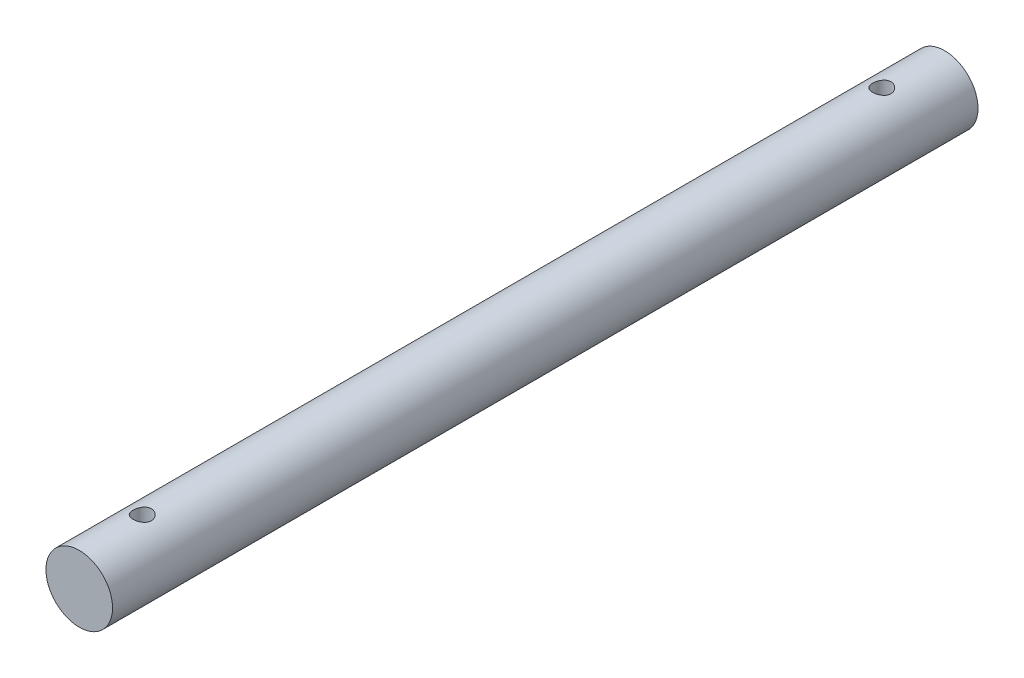
ISO-10303-21;
HEADER;
FILE_DESCRIPTION(('STEP AP214'),'2;1');
FILE_NAME('part.step','',(''),(''),'','','');
FILE_SCHEMA(('AUTOMOTIVE_DESIGN { 1 0 10303 214 1 1 1 1 }'));
ENDSEC;
DATA;
#1=APPLICATION_CONTEXT('core data for automotive mechanical design processes');
#2=APPLICATION_PROTOCOL_DEFINITION('international standard','automotive_design',2000,#1);
#3=PRODUCT_CONTEXT('',#1,'mechanical');
#4=PRODUCT('Part','Part','',(#3));
#5=PRODUCT_RELATED_PRODUCT_CATEGORY('part','',(#4));
#6=PRODUCT_DEFINITION_FORMATION('','',#4);
#7=PRODUCT_DEFINITION_CONTEXT('part definition',#1,'design');
#8=PRODUCT_DEFINITION('design','',#6,#7);
#9=PRODUCT_DEFINITION_SHAPE('','',#8);
#10=(LENGTH_UNIT() NAMED_UNIT(*) SI_UNIT(.MILLI.,.METRE.));
#11=(NAMED_UNIT(*) PLANE_ANGLE_UNIT() SI_UNIT($,.RADIAN.));
#12=(NAMED_UNIT(*) SI_UNIT($,.STERADIAN.) SOLID_ANGLE_UNIT());
#13=UNCERTAINTY_MEASURE_WITH_UNIT(LENGTH_MEASURE(1.E-05),#10,'distance_accuracy_value','');
#14=(GEOMETRIC_REPRESENTATION_CONTEXT(3) GLOBAL_UNCERTAINTY_ASSIGNED_CONTEXT((#13)) GLOBAL_UNIT_ASSIGNED_CONTEXT((#10,
#11,#12)) REPRESENTATION_CONTEXT('',''));
#15=CARTESIAN_POINT('',(0.,0.,0.));
#16=DIRECTION('',(0.,0.,1.));
#17=DIRECTION('',(1.,0.,0.));
#18=AXIS2_PLACEMENT_3D('',#15,#16,#17);
#19=CARTESIAN_POINT('',(0.,0.,165.));
#20=DIRECTION('',(0.,0.,-1.));
#21=DIRECTION('',(-1.,0.,0.));
#22=AXIS2_PLACEMENT_3D('',#19,#20,#21);
#23=CYLINDRICAL_SURFACE('',#22,6.35);
#24=CARTESIAN_POINT('',(0.,-6.35,13.75));
#25=CARTESIAN_POINT('',(0.0963519088727711,-6.34999867632888,13.7499979722522));
#26=CARTESIAN_POINT('',(0.192725104479355,-6.34778557573284,13.7420159379501));
#27=CARTESIAN_POINT('',(0.382687404049166,-6.33917231251588,13.7103601208736));
#28=CARTESIAN_POINT('',(0.476275282158253,-6.33277033399392,13.6866795326332));
#29=CARTESIAN_POINT('',(0.657898060834848,-6.31648461747214,13.6244608815283));
#30=CARTESIAN_POINT('',(0.745940208566188,-6.30660553951491,13.5859426976602));
#31=CARTESIAN_POINT('',(0.914315444706306,-6.2844051890964,13.4952179872864));
#32=CARTESIAN_POINT('',(0.994647881541182,-6.27208371048882,13.4430103052238));
#33=CARTESIAN_POINT('',(1.14730128913682,-6.24598550703679,13.3250319990548));
#34=CARTESIAN_POINT('',(1.21940542146178,-6.23218259591821,13.2589865976986));
#35=CARTESIAN_POINT('',(1.3516672162458,-6.20484218880023,13.1157945484562));
#36=CARTESIAN_POINT('',(1.41182322728868,-6.19130472972315,13.0386463685312));
#37=CARTESIAN_POINT('',(1.51955971162734,-6.16575784450081,12.8736813267357));
#38=CARTESIAN_POINT('',(1.56688684325104,-6.15378133466715,12.7856934423482));
#39=CARTESIAN_POINT('',(1.64598886021075,-6.13309905563514,12.60262558299));
#40=CARTESIAN_POINT('',(1.67776683148114,-6.12439263752407,12.5075470195774));
#41=CARTESIAN_POINT('',(1.72410795404839,-6.11150732964254,12.3154072515994));
#42=CARTESIAN_POINT('',(1.73906600605339,-6.10722478121721,12.2184484161789));
#43=CARTESIAN_POINT('',(1.75257440461544,-6.10336272474979,12.0233102324382));
#44=CARTESIAN_POINT('',(1.7511280444799,-6.10378227272676,11.9251311330483));
#45=CARTESIAN_POINT('',(1.73218132150678,-6.1091844592592,11.733453890354));
#46=CARTESIAN_POINT('',(1.71516301402608,-6.1140300738052,11.6399036148967));
#47=CARTESIAN_POINT('',(1.66632929326106,-6.12751843096004,11.4570405860802));
#48=CARTESIAN_POINT('',(1.63451262583765,-6.13616149539368,11.3677281925823));
#49=CARTESIAN_POINT('',(1.55660241655713,-6.1563884762099,11.1946396936547));
#50=CARTESIAN_POINT('',(1.51034317029268,-6.16800622854485,11.1109422962485));
#51=CARTESIAN_POINT('',(1.40497640039737,-6.19285586921667,10.9523306185894));
#52=CARTESIAN_POINT('',(1.34586619363417,-6.2060880943833,10.8774181775699));
#53=CARTESIAN_POINT('',(1.21402875473287,-6.23324237421661,10.7357536441173));
#54=CARTESIAN_POINT('',(1.1408978916237,-6.24717237722987,10.669378147492));
#55=CARTESIAN_POINT('',(0.984371586439517,-6.27373931665034,10.5497533468747));
#56=CARTESIAN_POINT('',(0.900975683702518,-6.28637619497963,10.4965046322927));
#57=CARTESIAN_POINT('',(0.725677538022721,-6.30901976468089,10.404463341389));
#58=CARTESIAN_POINT('',(0.63373563103454,-6.31901326998532,10.3657428500394));
#59=CARTESIAN_POINT('',(0.444308077394627,-6.33514896111822,10.3044190510004));
#60=CARTESIAN_POINT('',(0.346823733220866,-6.34129204775181,10.2818119734093));
#61=CARTESIAN_POINT('',(0.152289233464204,-6.34889689335871,10.2539571535065));
#62=CARTESIAN_POINT('',(0.0553176087366918,-6.35049656566665,10.248197837111));
#63=CARTESIAN_POINT('',(-0.138207338003046,-6.34923293119334,10.252783830092));
#64=CARTESIAN_POINT('',(-0.23476070523862,-6.34637011963161,10.2631273524725));
#65=CARTESIAN_POINT('',(-0.422855479295822,-6.33659261452674,10.299207155861));
#66=CARTESIAN_POINT('',(-0.514456610077173,-6.32975399979316,10.3246546026308));
#67=CARTESIAN_POINT('',(-0.692078206811861,-6.31280403798355,10.3898813911304));
#68=CARTESIAN_POINT('',(-0.778098046797714,-6.30269232457343,10.4296623371607));
#69=CARTESIAN_POINT('',(-0.944076143072927,-6.27999893142339,10.523352291319));
#70=CARTESIAN_POINT('',(-1.02387339106312,-6.26737073917275,10.5775349829825));
#71=CARTESIAN_POINT('',(-1.17342140193015,-6.24110221310927,10.6981493975883));
#72=CARTESIAN_POINT('',(-1.24317003549124,-6.22746166570202,10.7645837098863));
#73=CARTESIAN_POINT('',(-1.37282234323046,-6.20019250778253,10.910208303409));
#74=CARTESIAN_POINT('',(-1.43236411423498,-6.1865767563179,10.9897238280738));
#75=CARTESIAN_POINT('',(-1.53727145833525,-6.1613487605109,11.1579088848369));
#76=CARTESIAN_POINT('',(-1.58263758500952,-6.14973643793979,11.2465780592925));
#77=CARTESIAN_POINT('',(-1.6575672902585,-6.12996519939161,11.4301408981596));
#78=CARTESIAN_POINT('',(-1.68721946856189,-6.12178697646601,11.5249962025192));
#79=CARTESIAN_POINT('',(-1.73007082482112,-6.10981664265364,11.7186129896961));
#80=CARTESIAN_POINT('',(-1.74327456097828,-6.10602331664286,11.8173733825025));
#81=CARTESIAN_POINT('',(-1.75257918487232,-6.10335860076689,12.0122783793584));
#82=CARTESIAN_POINT('',(-1.74926373166691,-6.10431923481735,12.108393226173));
#83=CARTESIAN_POINT('',(-1.72698809535782,-6.11065818123702,12.2986365456577));
#84=CARTESIAN_POINT('',(-1.70802836817025,-6.11603636486697,12.3927650761325));
#85=CARTESIAN_POINT('',(-1.65535117195365,-6.13050103505147,12.5755730459156));
#86=CARTESIAN_POINT('',(-1.62176531415431,-6.13955440279027,12.6642932169514));
#87=CARTESIAN_POINT('',(-1.54089107612842,-6.16034822130196,12.8349080898204));
#88=CARTESIAN_POINT('',(-1.49360041587854,-6.17208911912213,12.9168016530116));
#89=CARTESIAN_POINT('',(-1.38492373267777,-6.19739353518559,13.074204971082));
#90=CARTESIAN_POINT('',(-1.3231432438508,-6.21100256102313,13.1494350841929));
#91=CARTESIAN_POINT('',(-1.1879804426183,-6.23826480003665,13.2886497856069));
#92=CARTESIAN_POINT('',(-1.11459526948214,-6.25191802329291,13.3526315927976));
#93=CARTESIAN_POINT('',(-0.956242084730487,-6.27811133290747,13.46900582464));
#94=CARTESIAN_POINT('',(-0.871043881385525,-6.29061803846423,13.5210932108011));
#95=CARTESIAN_POINT('',(-0.6927566990203,-6.31273579212554,13.6101250437831));
#96=CARTESIAN_POINT('',(-0.599672481844751,-6.32234857193568,13.6470785514049));
#97=CARTESIAN_POINT('',(-0.422537342823388,-6.3364541555639,13.7003541015963));
#98=CARTESIAN_POINT('',(-0.339200192467298,-6.34149559617014,13.7189263039));
#99=CARTESIAN_POINT('',(-0.17058077386909,-6.34826891571434,13.7437494485749));
#100=CARTESIAN_POINT('',(-0.0852987284220124,-6.35000117182384,13.7500017951311));
#101=CARTESIAN_POINT('',(0.,-6.35,13.75));
#102=B_SPLINE_CURVE_WITH_KNOTS('',3,(#24,#25,#26,#27,#28,#29,#30,#31,#32,#33,#34,#35,#36,#37,
#38,#39,#40,#41,#42,#43,#44,#45,#46,#47,#48,#49,#50,#51,#52,#53,#54,#55,#56,#57,#58,#59,#60,#61,
#62,#63,#64,#65,#66,#67,#68,#69,#70,#71,#72,#73,#74,#75,#76,#77,#78,#79,#80,#81,#82,#83,#84,#85,
#86,#87,#88,#89,#90,#91,#92,#93,#94,#95,#96,#97,#98,#99,#100,#101),.UNSPECIFIED.,.T.,.F.,(4,2,2,
2,2,2,2,2,2,2,2,2,2,2,2,2,2,2,2,2,2,2,2,2,2,2,2,2,2,2,2,2,2,2,2,2,2,2,4),(0.,0.288742785383583,
0.577610825317706,0.866093186465203,1.15459990680863,1.44949634186622,1.74443350787695,
2.0448291201908,2.34516509085837,2.63829205755673,2.93136017788392,3.21565198677317,
3.49996789336338,3.78767378736865,4.07543980883368,4.37326080152658,4.67109516434464,
4.97038834669267,5.26961148326536,5.55964941687571,5.84965516611863,6.13428610036824,
6.41894890230507,6.70946497589746,7.0000425199995,7.29941558754897,7.59877696270436,
7.89643199466905,8.19400452194523,8.48113931351604,8.76826573750457,9.05286021964921,
9.33750207605805,9.63104328546516,9.92465697036179,10.225117310347,10.525397497878,
10.7810457813303,11.0366649249715),.UNSPECIFIED.);
#103=CARTESIAN_POINT('',(0.,-6.35,13.75));
#104=VERTEX_POINT('',#103);
#105=EDGE_CURVE('E10',#104,#104,#102,.T.);
#106=ORIENTED_EDGE('',*,*,#105,.T.);
#107=EDGE_LOOP('',(#106));
#108=FACE_BOUND('',#107,.T.);
#109=CARTESIAN_POINT('',(0.,6.35,13.75));
#110=CARTESIAN_POINT('',(-0.0963519088727681,6.34999867632888,13.7499979722522));
#111=CARTESIAN_POINT('',(-0.192725104479352,6.34778557573284,13.7420159379501));
#112=CARTESIAN_POINT('',(-0.382687404049163,6.33917231251588,13.7103601208736));
#113=CARTESIAN_POINT('',(-0.47627528215825,6.33277033399392,13.6866795326332));
#114=CARTESIAN_POINT('',(-0.657898060834845,6.31648461747214,13.6244608815283));
#115=CARTESIAN_POINT('',(-0.745940208566185,6.3066055395149,13.5859426976602));
#116=CARTESIAN_POINT('',(-0.914315444706302,6.2844051890964,13.4952179872864));
#117=CARTESIAN_POINT('',(-0.994647881541178,6.27208371048881,13.4430103052238));
#118=CARTESIAN_POINT('',(-1.14730128913682,6.24598550703679,13.3250319990548));
#119=CARTESIAN_POINT('',(-1.21940542146178,6.23218259591821,13.2589865976986));
#120=CARTESIAN_POINT('',(-1.3516672162458,6.20484218880023,13.1157945484562));
#121=CARTESIAN_POINT('',(-1.41182322728867,6.19130472972316,13.0386463685312));
#122=CARTESIAN_POINT('',(-1.51955971162734,6.16575784450082,12.8736813267357));
#123=CARTESIAN_POINT('',(-1.56688684325104,6.15378133466715,12.7856934423482));
#124=CARTESIAN_POINT('',(-1.64598886021074,6.13309905563514,12.60262558299));
#125=CARTESIAN_POINT('',(-1.67776683148113,6.12439263752407,12.5075470195774));
#126=CARTESIAN_POINT('',(-1.72410795404839,6.11150732964254,12.3154072515994));
#127=CARTESIAN_POINT('',(-1.73906600605339,6.10722478121721,12.2184484161789));
#128=CARTESIAN_POINT('',(-1.75257440461543,6.10336272474979,12.0233102324382));
#129=CARTESIAN_POINT('',(-1.7511280444799,6.10378227272676,11.9251311330483));
#130=CARTESIAN_POINT('',(-1.73218132150678,6.1091844592592,11.733453890354));
#131=CARTESIAN_POINT('',(-1.71516301402608,6.1140300738052,11.6399036148967));
#132=CARTESIAN_POINT('',(-1.66632929326106,6.12751843096004,11.4570405860802));
#133=CARTESIAN_POINT('',(-1.63451262583765,6.13616149539368,11.3677281925823));
#134=CARTESIAN_POINT('',(-1.55660241655712,6.1563884762099,11.1946396936547));
#135=CARTESIAN_POINT('',(-1.51034317029268,6.16800622854485,11.1109422962485));
#136=CARTESIAN_POINT('',(-1.40497640039737,6.19285586921667,10.9523306185894));
#137=CARTESIAN_POINT('',(-1.34586619363416,6.2060880943833,10.8774181775699));
#138=CARTESIAN_POINT('',(-1.21402875473286,6.23324237421661,10.7357536441173));
#139=CARTESIAN_POINT('',(-1.14089789162369,6.24717237722987,10.669378147492));
#140=CARTESIAN_POINT('',(-0.984371586439513,6.27373931665034,10.5497533468747));
#141=CARTESIAN_POINT('',(-0.900975683702515,6.28637619497963,10.4965046322927));
#142=CARTESIAN_POINT('',(-0.725677538022718,6.30901976468089,10.404463341389));
#143=CARTESIAN_POINT('',(-0.633735631034537,6.31901326998532,10.3657428500394));
#144=CARTESIAN_POINT('',(-0.444308077394624,6.33514896111822,10.3044190510004));
#145=CARTESIAN_POINT('',(-0.346823733220863,6.34129204775181,10.2818119734093));
#146=CARTESIAN_POINT('',(-0.1522892334642,6.34889689335871,10.2539571535065));
#147=CARTESIAN_POINT('',(-0.0553176087366886,6.35049656566665,10.248197837111));
#148=CARTESIAN_POINT('',(0.138207338003049,6.34923293119334,10.252783830092));
#149=CARTESIAN_POINT('',(0.234760705238623,6.34637011963161,10.2631273524725));
#150=CARTESIAN_POINT('',(0.422855479295825,6.33659261452674,10.299207155861));
#151=CARTESIAN_POINT('',(0.514456610077176,6.32975399979316,10.3246546026308));
#152=CARTESIAN_POINT('',(0.692078206811864,6.31280403798355,10.3898813911304));
#153=CARTESIAN_POINT('',(0.778098046797718,6.30269232457343,10.4296623371607));
#154=CARTESIAN_POINT('',(0.94407614307293,6.27999893142339,10.523352291319));
#155=CARTESIAN_POINT('',(1.02387339106313,6.26737073917275,10.5775349829825));
#156=CARTESIAN_POINT('',(1.17342140193016,6.24110221310927,10.6981493975883));
#157=CARTESIAN_POINT('',(1.24317003549125,6.22746166570202,10.7645837098863));
#158=CARTESIAN_POINT('',(1.37282234323046,6.20019250778253,10.910208303409));
#159=CARTESIAN_POINT('',(1.43236411423498,6.1865767563179,10.9897238280738));
#160=CARTESIAN_POINT('',(1.53727145833525,6.16134876051089,11.1579088848369));
#161=CARTESIAN_POINT('',(1.58263758500952,6.14973643793978,11.2465780592925));
#162=CARTESIAN_POINT('',(1.6575672902585,6.12996519939161,11.4301408981596));
#163=CARTESIAN_POINT('',(1.68721946856189,6.121786976466,11.5249962025192));
#164=CARTESIAN_POINT('',(1.73007082482112,6.10981664265364,11.7186129896961));
#165=CARTESIAN_POINT('',(1.74327456097828,6.10602331664285,11.8173733825025));
#166=CARTESIAN_POINT('',(1.75257918487232,6.10335860076689,12.0122783793584));
#167=CARTESIAN_POINT('',(1.74926373166691,6.10431923481735,12.108393226173));
#168=CARTESIAN_POINT('',(1.72698809535783,6.11065818123702,12.2986365456577));
#169=CARTESIAN_POINT('',(1.70802836817025,6.11603636486696,12.3927650761325));
#170=CARTESIAN_POINT('',(1.65535117195365,6.13050103505146,12.5755730459156));
#171=CARTESIAN_POINT('',(1.62176531415431,6.13955440279026,12.6642932169514));
#172=CARTESIAN_POINT('',(1.54089107612843,6.16034822130196,12.8349080898204));
#173=CARTESIAN_POINT('',(1.49360041587855,6.17208911912212,12.9168016530116));
#174=CARTESIAN_POINT('',(1.38492373267778,6.19739353518559,13.074204971082));
#175=CARTESIAN_POINT('',(1.32314324385081,6.21100256102313,13.1494350841929));
#176=CARTESIAN_POINT('',(1.1879804426183,6.23826480003665,13.2886497856069));
#177=CARTESIAN_POINT('',(1.11459526948214,6.25191802329291,13.3526315927976));
#178=CARTESIAN_POINT('',(0.956242084730492,6.27811133290746,13.46900582464));
#179=CARTESIAN_POINT('',(0.87104388138553,6.29061803846423,13.5210932108011));
#180=CARTESIAN_POINT('',(0.692756699020306,6.31273579212554,13.6101250437831));
#181=CARTESIAN_POINT('',(0.599672481844755,6.32234857193568,13.6470785514049));
#182=CARTESIAN_POINT('',(0.422537342823392,6.3364541555639,13.7003541015963));
#183=CARTESIAN_POINT('',(0.339200192467303,6.34149559617013,13.7189263039));
#184=CARTESIAN_POINT('',(0.170580773869094,6.34826891571434,13.7437494485749));
#185=CARTESIAN_POINT('',(0.0852987284220158,6.35000117182384,13.7500017951311));
#186=CARTESIAN_POINT('',(0.,6.35,13.75));
#187=B_SPLINE_CURVE_WITH_KNOTS('',3,(#109,#110,#111,#112,#113,#114,#115,#116,#117,#118,#119,
#120,#121,#122,#123,#124,#125,#126,#127,#128,#129,#130,#131,#132,#133,#134,#135,#136,#137,#138,
#139,#140,#141,#142,#143,#144,#145,#146,#147,#148,#149,#150,#151,#152,#153,#154,#155,#156,#157,
#158,#159,#160,#161,#162,#163,#164,#165,#166,#167,#168,#169,#170,#171,#172,#173,#174,#175,#176,
#177,#178,#179,#180,#181,#182,#183,#184,#185,#186),.UNSPECIFIED.,.T.,.F.,(4,2,2,2,2,2,2,2,2,2,2,
2,2,2,2,2,2,2,2,2,2,2,2,2,2,2,2,2,2,2,2,2,2,2,2,2,2,2,4),(0.,0.288742785383583,
0.577610825317706,0.866093186465203,1.15459990680863,1.44949634186622,1.74443350787695,
2.04482912019081,2.34516509085837,2.63829205755673,2.93136017788392,3.21565198677317,
3.49996789336338,3.78767378736865,4.07543980883368,4.37326080152658,4.67109516434464,
4.97038834669267,5.26961148326536,5.55964941687571,5.84965516611863,6.13428610036824,
6.41894890230507,6.70946497589746,7.00004251999949,7.29941558754897,7.59877696270436,
7.89643199466905,8.19400452194523,8.48113931351604,8.76826573750457,9.0528602196492,
9.33750207605804,9.63104328546516,9.92465697036178,10.225117310347,10.525397497878,
10.7810457813303,11.0366649249715),.UNSPECIFIED.);
#188=CARTESIAN_POINT('',(0.,6.35,13.75));
#189=VERTEX_POINT('',#188);
#190=EDGE_CURVE('E44',#189,#189,#187,.T.);
#191=ORIENTED_EDGE('',*,*,#190,.T.);
#192=EDGE_LOOP('',(#191));
#193=FACE_BOUND('',#192,.T.);
#194=CARTESIAN_POINT('',(0.,-6.35,154.75));
#195=CARTESIAN_POINT('',(0.0963519088727893,-6.34999867632888,154.749997972252));
#196=CARTESIAN_POINT('',(0.192725104479373,-6.34778557573284,154.74201593795));
#197=CARTESIAN_POINT('',(0.382687404049185,-6.33917231251588,154.710360120874));
#198=CARTESIAN_POINT('',(0.476275282158271,-6.33277033399392,154.686679532633));
#199=CARTESIAN_POINT('',(0.65789806083487,-6.31648461747213,154.624460881528));
#200=CARTESIAN_POINT('',(0.745940208566214,-6.3066055395149,154.58594269766));
#201=CARTESIAN_POINT('',(0.914315444706334,-6.2844051890964,154.495217987286));
#202=CARTESIAN_POINT('',(0.994647881541208,-6.27208371048881,154.443010305224));
#203=CARTESIAN_POINT('',(1.14730128913685,-6.24598550703679,154.325031999055));
#204=CARTESIAN_POINT('',(1.21940542146182,-6.23218259591821,154.258986597699));
#205=CARTESIAN_POINT('',(1.35166721624583,-6.20484218880022,154.115794548456));
#206=CARTESIAN_POINT('',(1.4118232272887,-6.19130472972315,154.038646368531));
#207=CARTESIAN_POINT('',(1.51955971162735,-6.16575784450081,153.873681326736));
#208=CARTESIAN_POINT('',(1.56688684325104,-6.15378133466715,153.785693442348));
#209=CARTESIAN_POINT('',(1.64598886021075,-6.13309905563514,153.60262558299));
#210=CARTESIAN_POINT('',(1.67776683148114,-6.12439263752406,153.507547019577));
#211=CARTESIAN_POINT('',(1.72410795404841,-6.11150732964254,153.315407251599));
#212=CARTESIAN_POINT('',(1.73906600605341,-6.10722478121721,153.218448416179));
#213=CARTESIAN_POINT('',(1.75257440461546,-6.10336272474978,153.023310232438));
#214=CARTESIAN_POINT('',(1.75112804447992,-6.10378227272676,152.925131133048));
#215=CARTESIAN_POINT('',(1.73218132150679,-6.10918445925919,152.733453890354));
#216=CARTESIAN_POINT('',(1.7151630140261,-6.1140300738052,152.639903614897));
#217=CARTESIAN_POINT('',(1.66632929326108,-6.12751843096003,152.45704058608));
#218=CARTESIAN_POINT('',(1.63451262583767,-6.13616149539367,152.367728192582));
#219=CARTESIAN_POINT('',(1.55660241655715,-6.1563884762099,152.194639693655));
#220=CARTESIAN_POINT('',(1.51034317029271,-6.16800622854484,152.110942296249));
#221=CARTESIAN_POINT('',(1.4049764003974,-6.19285586921666,151.952330618589));
#222=CARTESIAN_POINT('',(1.34586619363419,-6.2060880943833,151.87741817757));
#223=CARTESIAN_POINT('',(1.21402875473287,-6.23324237421661,151.735753644117));
#224=CARTESIAN_POINT('',(1.1408978916237,-6.24717237722987,151.669378147492));
#225=CARTESIAN_POINT('',(0.984371586439519,-6.27373931665034,151.549753346875));
#226=CARTESIAN_POINT('',(0.900975683702526,-6.28637619497962,151.496504632293));
#227=CARTESIAN_POINT('',(0.72567753802273,-6.30901976468088,151.404463341389));
#228=CARTESIAN_POINT('',(0.633735631034546,-6.31901326998532,151.365742850039));
#229=CARTESIAN_POINT('',(0.444308077394631,-6.33514896111822,151.304419051));
#230=CARTESIAN_POINT('',(0.346823733220872,-6.34129204775181,151.281811973409));
#231=CARTESIAN_POINT('',(0.152289233464212,-6.34889689335871,151.253957153507));
#232=CARTESIAN_POINT('',(0.0553176087367009,-6.35049656566665,151.248197837111));
#233=CARTESIAN_POINT('',(-0.138207338003038,-6.34923293119334,151.252783830092));
#234=CARTESIAN_POINT('',(-0.234760705238613,-6.34637011963161,151.263127352473));
#235=CARTESIAN_POINT('',(-0.422855479295813,-6.33659261452674,151.299207155861));
#236=CARTESIAN_POINT('',(-0.514456610077161,-6.32975399979316,151.324654602631));
#237=CARTESIAN_POINT('',(-0.692078206811848,-6.31280403798355,151.38988139113));
#238=CARTESIAN_POINT('',(-0.778098046797705,-6.30269232457343,151.429662337161));
#239=CARTESIAN_POINT('',(-0.944076143072919,-6.27999893142339,151.523352291319));
#240=CARTESIAN_POINT('',(-1.02387339106311,-6.26737073917276,151.577534982983));
#241=CARTESIAN_POINT('',(-1.17342140193014,-6.24110221310927,151.698149397588));
#242=CARTESIAN_POINT('',(-1.24317003549122,-6.22746166570202,151.764583709886));
#243=CARTESIAN_POINT('',(-1.37282234323044,-6.20019250778254,151.910208303409));
#244=CARTESIAN_POINT('',(-1.43236411423496,-6.1865767563179,151.989723828074));
#245=CARTESIAN_POINT('',(-1.53727145833523,-6.1613487605109,152.157908884837));
#246=CARTESIAN_POINT('',(-1.58263758500951,-6.14973643793979,152.246578059293));
#247=CARTESIAN_POINT('',(-1.65756729025848,-6.12996519939162,152.43014089816));
#248=CARTESIAN_POINT('',(-1.68721946856187,-6.12178697646601,152.524996202519));
#249=CARTESIAN_POINT('',(-1.7300708248211,-6.10981664265364,152.718612989696));
#250=CARTESIAN_POINT('',(-1.74327456097826,-6.10602331664286,152.817373382502));
#251=CARTESIAN_POINT('',(-1.7525791848723,-6.10335860076689,153.012278379358));
#252=CARTESIAN_POINT('',(-1.74926373166689,-6.10431923481736,153.108393226173));
#253=CARTESIAN_POINT('',(-1.72698809535781,-6.11065818123702,153.298636545658));
#254=CARTESIAN_POINT('',(-1.70802836817023,-6.11603636486697,153.392765076133));
#255=CARTESIAN_POINT('',(-1.65535117195363,-6.13050103505147,153.575573045916));
#256=CARTESIAN_POINT('',(-1.62176531415429,-6.13955440279027,153.664293216951));
#257=CARTESIAN_POINT('',(-1.54089107612841,-6.16034822130197,153.83490808982));
#258=CARTESIAN_POINT('',(-1.49360041587853,-6.17208911912213,153.916801653012));
#259=CARTESIAN_POINT('',(-1.38492373267776,-6.19739353518559,154.074204971082));
#260=CARTESIAN_POINT('',(-1.32314324385079,-6.21100256102313,154.149435084193));
#261=CARTESIAN_POINT('',(-1.18798044261829,-6.23826480003665,154.288649785607));
#262=CARTESIAN_POINT('',(-1.11459526948213,-6.25191802329291,154.352631592798));
#263=CARTESIAN_POINT('',(-0.95624208473048,-6.27811133290747,154.46900582464));
#264=CARTESIAN_POINT('',(-0.871043881385514,-6.29061803846423,154.521093210801));
#265=CARTESIAN_POINT('',(-0.692756699020283,-6.31273579212554,154.610125043783));
#266=CARTESIAN_POINT('',(-0.59967248184473,-6.32234857193569,154.647078551405));
#267=CARTESIAN_POINT('',(-0.422537342823363,-6.3364541555639,154.700354101596));
#268=CARTESIAN_POINT('',(-0.339200192467274,-6.34149559617014,154.7189263039));
#269=CARTESIAN_POINT('',(-0.170580773869068,-6.34826891571434,154.743749448575));
#270=CARTESIAN_POINT('',(-0.0852987284219928,-6.35000117182384,154.750001795131));
#271=CARTESIAN_POINT('',(0.,-6.35,154.75));
#272=B_SPLINE_CURVE_WITH_KNOTS('',3,(#194,#195,#196,#197,#198,#199,#200,#201,#202,#203,#204,
#205,#206,#207,#208,#209,#210,#211,#212,#213,#214,#215,#216,#217,#218,#219,#220,#221,#222,#223,
#224,#225,#226,#227,#228,#229,#230,#231,#232,#233,#234,#235,#236,#237,#238,#239,#240,#241,#242,
#243,#244,#245,#246,#247,#248,#249,#250,#251,#252,#253,#254,#255,#256,#257,#258,#259,#260,#261,
#262,#263,#264,#265,#266,#267,#268,#269,#270,#271),.UNSPECIFIED.,.T.,.F.,(4,2,2,2,2,2,2,2,2,2,2,
2,2,2,2,2,2,2,2,2,2,2,2,2,2,2,2,2,2,2,2,2,2,2,2,2,2,2,4),(0.,0.288742785383586,
0.577610825317708,0.866093186465209,1.15459990680864,1.44949634186625,1.74443350787696,
2.04482912019075,2.34516509085834,2.63829205755673,2.93136017788394,3.21565198677317,
3.49996789336339,3.78767378736862,4.07543980883371,4.37326080152659,4.67109516434465,
4.97038834669268,5.26961148326536,5.55964941687572,5.84965516611864,6.13428610036825,
6.41894890230507,6.70946497589747,7.00004251999949,7.29941558754897,7.59877696270435,
7.89643199466904,8.19400452194525,8.48113931351605,8.76826573750455,9.05286021964918,
9.33750207605805,9.63104328546515,9.92465697036178,10.225117310347,10.5253974978781,
10.7810457813303,11.0366649249715),.UNSPECIFIED.);
#273=CARTESIAN_POINT('',(0.,-6.35,154.75));
#274=VERTEX_POINT('',#273);
#275=EDGE_CURVE('E48',#274,#274,#272,.T.);
#276=ORIENTED_EDGE('',*,*,#275,.T.);
#277=EDGE_LOOP('',(#276));
#278=FACE_BOUND('',#277,.T.);
#279=CARTESIAN_POINT('',(0.,6.35,154.75));
#280=CARTESIAN_POINT('',(-0.0963519088727516,6.34999867632888,154.749997972252));
#281=CARTESIAN_POINT('',(-0.192725104479336,6.34778557573284,154.74201593795));
#282=CARTESIAN_POINT('',(-0.382687404049147,6.33917231251588,154.710360120874));
#283=CARTESIAN_POINT('',(-0.476275282158233,6.33277033399392,154.686679532633));
#284=CARTESIAN_POINT('',(-0.657898060834832,6.31648461747214,154.624460881528));
#285=CARTESIAN_POINT('',(-0.745940208566176,6.30660553951491,154.58594269766));
#286=CARTESIAN_POINT('',(-0.914315444706297,6.2844051890964,154.495217987286));
#287=CARTESIAN_POINT('',(-0.994647881541171,6.27208371048882,154.443010305224));
#288=CARTESIAN_POINT('',(-1.14730128913682,6.24598550703679,154.325031999055));
#289=CARTESIAN_POINT('',(-1.21940542146178,6.23218259591821,154.258986597699));
#290=CARTESIAN_POINT('',(-1.35166721624579,6.20484218880023,154.115794548456));
#291=CARTESIAN_POINT('',(-1.41182322728866,6.19130472972316,154.038646368531));
#292=CARTESIAN_POINT('',(-1.51955971162732,6.16575784450082,153.873681326736));
#293=CARTESIAN_POINT('',(-1.566886843251,6.15378133466716,153.785693442348));
#294=CARTESIAN_POINT('',(-1.64598886021071,6.13309905563515,153.60262558299));
#295=CARTESIAN_POINT('',(-1.67776683148111,6.12439263752408,153.507547019577));
#296=CARTESIAN_POINT('',(-1.72410795404837,6.11150732964255,153.315407251599));
#297=CARTESIAN_POINT('',(-1.73906600605337,6.10722478121722,153.218448416179));
#298=CARTESIAN_POINT('',(-1.75257440461542,6.1033627247498,153.023310232438));
#299=CARTESIAN_POINT('',(-1.75112804447989,6.10378227272677,152.925131133048));
#300=CARTESIAN_POINT('',(-1.73218132150676,6.1091844592592,152.733453890354));
#301=CARTESIAN_POINT('',(-1.71516301402606,6.11403007380521,152.639903614897));
#302=CARTESIAN_POINT('',(-1.66632929326105,6.12751843096004,152.45704058608));
#303=CARTESIAN_POINT('',(-1.63451262583764,6.13616149539368,152.367728192582));
#304=CARTESIAN_POINT('',(-1.5566024165571,6.15638847620991,152.194639693655));
#305=CARTESIAN_POINT('',(-1.51034317029265,6.16800622854486,152.110942296249));
#306=CARTESIAN_POINT('',(-1.40497640039734,6.19285586921667,151.952330618589));
#307=CARTESIAN_POINT('',(-1.34586619363414,6.2060880943833,151.87741817757));
#308=CARTESIAN_POINT('',(-1.21402875473284,6.23324237421662,151.735753644117));
#309=CARTESIAN_POINT('',(-1.14089789162366,6.24717237722988,151.669378147492));
#310=CARTESIAN_POINT('',(-0.984371586439481,6.27373931665034,151.549753346875));
#311=CARTESIAN_POINT('',(-0.900975683702488,6.28637619497963,151.496504632293));
#312=CARTESIAN_POINT('',(-0.725677538022693,6.30901976468089,151.404463341389));
#313=CARTESIAN_POINT('',(-0.633735631034509,6.31901326998532,151.365742850039));
#314=CARTESIAN_POINT('',(-0.444308077394595,6.33514896111822,151.304419051));
#315=CARTESIAN_POINT('',(-0.346823733220836,6.34129204775181,151.281811973409));
#316=CARTESIAN_POINT('',(-0.152289233464176,6.34889689335871,151.253957153507));
#317=CARTESIAN_POINT('',(-0.0553176087366653,6.35049656566665,151.248197837111));
#318=CARTESIAN_POINT('',(0.138207338003073,6.34923293119334,151.252783830092));
#319=CARTESIAN_POINT('',(0.234760705238648,6.34637011963161,151.263127352473));
#320=CARTESIAN_POINT('',(0.422855479295848,6.33659261452674,151.299207155861));
#321=CARTESIAN_POINT('',(0.514456610077196,6.32975399979316,151.324654602631));
#322=CARTESIAN_POINT('',(0.692078206811884,6.31280403798355,151.38988139113));
#323=CARTESIAN_POINT('',(0.778098046797741,6.30269232457343,151.429662337161));
#324=CARTESIAN_POINT('',(0.944076143072955,6.27999893142338,151.523352291319));
#325=CARTESIAN_POINT('',(1.02387339106315,6.26737073917275,151.577534982983));
#326=CARTESIAN_POINT('',(1.17342140193018,6.24110221310927,151.698149397588));
#327=CARTESIAN_POINT('',(1.24317003549126,6.22746166570201,151.764583709886));
#328=CARTESIAN_POINT('',(1.37282234323047,6.20019250778253,151.910208303409));
#329=CARTESIAN_POINT('',(1.432364114235,6.1865767563179,151.989723828074));
#330=CARTESIAN_POINT('',(1.53727145833526,6.16134876051089,152.157908884837));
#331=CARTESIAN_POINT('',(1.58263758500954,6.14973643793978,152.246578059293));
#332=CARTESIAN_POINT('',(1.65756729025852,6.12996519939161,152.43014089816));
#333=CARTESIAN_POINT('',(1.6872194685619,6.121786976466,152.524996202519));
#334=CARTESIAN_POINT('',(1.73007082482114,6.10981664265363,152.718612989696));
#335=CARTESIAN_POINT('',(1.7432745609783,6.10602331664285,152.817373382502));
#336=CARTESIAN_POINT('',(1.75257918487234,6.10335860076688,153.012278379358));
#337=CARTESIAN_POINT('',(1.74926373166693,6.10431923481734,153.108393226173));
#338=CARTESIAN_POINT('',(1.72698809535784,6.11065818123701,153.298636545658));
#339=CARTESIAN_POINT('',(1.70802836817027,6.11603636486696,153.392765076133));
#340=CARTESIAN_POINT('',(1.65535117195367,6.13050103505146,153.575573045916));
#341=CARTESIAN_POINT('',(1.62176531415433,6.13955440279026,153.664293216951));
#342=CARTESIAN_POINT('',(1.54089107612845,6.16034822130196,153.83490808982));
#343=CARTESIAN_POINT('',(1.49360041587857,6.17208911912212,153.916801653012));
#344=CARTESIAN_POINT('',(1.3849237326778,6.19739353518559,154.074204971082));
#345=CARTESIAN_POINT('',(1.32314324385083,6.21100256102312,154.149435084193));
#346=CARTESIAN_POINT('',(1.18798044261832,6.23826480003664,154.288649785607));
#347=CARTESIAN_POINT('',(1.11459526948216,6.2519180232929,154.352631592798));
#348=CARTESIAN_POINT('',(0.956242084730518,6.27811133290746,154.46900582464));
#349=CARTESIAN_POINT('',(0.871043881385552,6.29061803846423,154.521093210801));
#350=CARTESIAN_POINT('',(0.692756699020322,6.31273579212554,154.610125043783));
#351=CARTESIAN_POINT('',(0.599672481844768,6.32234857193568,154.647078551405));
#352=CARTESIAN_POINT('',(0.422537342823401,6.3364541555639,154.700354101596));
#353=CARTESIAN_POINT('',(0.339200192467312,6.34149559617013,154.7189263039));
#354=CARTESIAN_POINT('',(0.170580773869106,6.34826891571434,154.743749448575));
#355=CARTESIAN_POINT('',(0.0852987284220301,6.35000117182384,154.750001795131));
#356=CARTESIAN_POINT('',(0.,6.35,154.75));
#357=B_SPLINE_CURVE_WITH_KNOTS('',3,(#279,#280,#281,#282,#283,#284,#285,#286,#287,#288,#289,
#290,#291,#292,#293,#294,#295,#296,#297,#298,#299,#300,#301,#302,#303,#304,#305,#306,#307,#308,
#309,#310,#311,#312,#313,#314,#315,#316,#317,#318,#319,#320,#321,#322,#323,#324,#325,#326,#327,
#328,#329,#330,#331,#332,#333,#334,#335,#336,#337,#338,#339,#340,#341,#342,#343,#344,#345,#346,
#347,#348,#349,#350,#351,#352,#353,#354,#355,#356),.UNSPECIFIED.,.T.,.F.,(4,2,2,2,2,2,2,2,2,2,2,
2,2,2,2,2,2,2,2,2,2,2,2,2,2,2,2,2,2,2,2,2,2,2,2,2,2,2,4),(0.,0.288742785383586,
0.577610825317708,0.866093186465209,1.15459990680864,1.44949634186625,1.74443350787696,
2.04482912019075,2.34516509085834,2.6382920575567,2.93136017788391,3.21565198677314,
3.49996789336339,3.78767378736866,4.0754398088337,4.37326080152659,4.67109516434465,
4.97038834669268,5.26961148326536,5.55964941687571,5.84965516611863,6.13428610036825,
6.41894890230506,6.70946497589746,7.00004251999949,7.29941558754897,7.59877696270432,
7.89643199466903,8.19400452194524,8.48113931351604,8.76826573750455,9.05286021964918,
9.33750207605805,9.63104328546515,9.92465697036178,10.225117310347,10.5253974978781,
10.7810457813303,11.0366649249715),.UNSPECIFIED.);
#358=CARTESIAN_POINT('',(0.,6.35,154.75));
#359=VERTEX_POINT('',#358);
#360=EDGE_CURVE('E52',#359,#359,#357,.T.);
#361=ORIENTED_EDGE('',*,*,#360,.T.);
#362=EDGE_LOOP('',(#361));
#363=FACE_BOUND('',#362,.T.);
#364=CARTESIAN_POINT('',(0.,0.,165.));
#365=DIRECTION('',(0.,0.,1.));
#366=DIRECTION('',(1.,0.,0.));
#367=AXIS2_PLACEMENT_3D('',#364,#365,#366);
#368=CIRCLE('',#367,6.35);
#369=CARTESIAN_POINT('',(6.35,0.,165.));
#370=VERTEX_POINT('',#369);
#371=EDGE_CURVE('E77',#370,#370,#368,.T.);
#372=ORIENTED_EDGE('',*,*,#371,.F.);
#373=EDGE_LOOP('',(#372));
#374=FACE_BOUND('',#373,.T.);
#375=CARTESIAN_POINT('',(0.,0.,0.));
#376=DIRECTION('',(0.,0.,1.));
#377=DIRECTION('',(1.,0.,0.));
#378=AXIS2_PLACEMENT_3D('',#375,#376,#377);
#379=CIRCLE('',#378,6.35);
#380=CARTESIAN_POINT('',(6.35,0.,0.));
#381=VERTEX_POINT('',#380);
#382=EDGE_CURVE('E78',#381,#381,#379,.T.);
#383=ORIENTED_EDGE('',*,*,#382,.T.);
#384=EDGE_LOOP('',(#383));
#385=FACE_BOUND('',#384,.T.);
#386=ADVANCED_FACE('F34',(#108,#193,#278,#363,#374,#385),#23,.T.);
#387=CARTESIAN_POINT('',(0.,0.,165.));
#388=DIRECTION('',(0.,0.,1.));
#389=DIRECTION('',(1.,0.,0.));
#390=AXIS2_PLACEMENT_3D('',#387,#388,#389);
#391=PLANE('',#390);
#392=ORIENTED_EDGE('',*,*,#371,.T.);
#393=EDGE_LOOP('',(#392));
#394=FACE_BOUND('',#393,.T.);
#395=ADVANCED_FACE('F71',(#394),#391,.T.);
#396=CARTESIAN_POINT('',(0.,0.,0.));
#397=DIRECTION('',(0.,0.,1.));
#398=DIRECTION('',(1.,0.,0.));
#399=AXIS2_PLACEMENT_3D('',#396,#397,#398);
#400=PLANE('',#399);
#401=ORIENTED_EDGE('',*,*,#382,.F.);
#402=EDGE_LOOP('',(#401));
#403=FACE_BOUND('',#402,.T.);
#404=ADVANCED_FACE('F69',(#403),#400,.F.);
#405=CARTESIAN_POINT('',(0.,-6.35,153.));
#406=DIRECTION('',(0.,1.,0.));
#407=DIRECTION('',(0.,0.,1.));
#408=AXIS2_PLACEMENT_3D('',#405,#406,#407);
#409=CYLINDRICAL_SURFACE('',#408,1.75);
#410=ORIENTED_EDGE('',*,*,#360,.F.);
#411=EDGE_LOOP('',(#410));
#412=FACE_BOUND('',#411,.T.);
#413=ORIENTED_EDGE('',*,*,#275,.F.);
#414=EDGE_LOOP('',(#413));
#415=FACE_BOUND('',#414,.T.);
#416=ADVANCED_FACE('F63',(#412,#415),#409,.F.);
#417=CARTESIAN_POINT('',(0.,-6.35,12.));
#418=DIRECTION('',(0.,1.,0.));
#419=DIRECTION('',(0.,0.,1.));
#420=AXIS2_PLACEMENT_3D('',#417,#418,#419);
#421=CYLINDRICAL_SURFACE('',#420,1.75);
#422=ORIENTED_EDGE('',*,*,#190,.F.);
#423=EDGE_LOOP('',(#422));
#424=FACE_BOUND('',#423,.T.);
#425=ORIENTED_EDGE('',*,*,#105,.F.);
#426=EDGE_LOOP('',(#425));
#427=FACE_BOUND('',#426,.T.);
#428=ADVANCED_FACE('F60',(#424,#427),#421,.F.);
#429=CLOSED_SHELL('',(#386,#395,#404,#416,#428));
#430=MANIFOLD_SOLID_BREP('B2',#429);
#431=ADVANCED_BREP_SHAPE_REPRESENTATION('',(#18,#430),#14);
#432=SHAPE_DEFINITION_REPRESENTATION(#9,#431);
ENDSEC;
END-ISO-10303-21;
